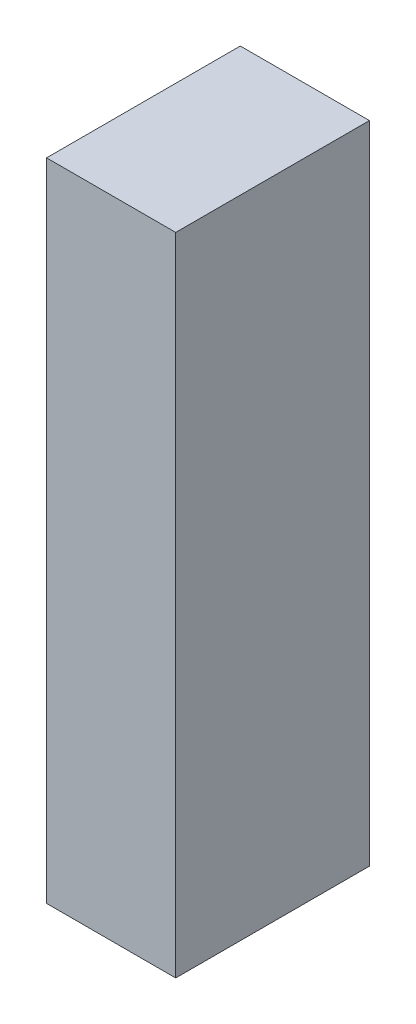
ISO-10303-21;
HEADER;
FILE_DESCRIPTION(('STEP AP214'),'2;1');
FILE_NAME('part.step','',(''),(''),'','','');
FILE_SCHEMA(('AUTOMOTIVE_DESIGN { 1 0 10303 214 1 1 1 1 }'));
ENDSEC;
DATA;
#1=APPLICATION_CONTEXT('core data for automotive mechanical design processes');
#2=APPLICATION_PROTOCOL_DEFINITION('international standard','automotive_design',2000,#1);
#3=PRODUCT_CONTEXT('',#1,'mechanical');
#4=PRODUCT('Part','Part','',(#3));
#5=PRODUCT_RELATED_PRODUCT_CATEGORY('part','',(#4));
#6=PRODUCT_DEFINITION_FORMATION('','',#4);
#7=PRODUCT_DEFINITION_CONTEXT('part definition',#1,'design');
#8=PRODUCT_DEFINITION('design','',#6,#7);
#9=PRODUCT_DEFINITION_SHAPE('','',#8);
#10=(LENGTH_UNIT() NAMED_UNIT(*) SI_UNIT(.MILLI.,.METRE.));
#11=(NAMED_UNIT(*) PLANE_ANGLE_UNIT() SI_UNIT($,.RADIAN.));
#12=(NAMED_UNIT(*) SI_UNIT($,.STERADIAN.) SOLID_ANGLE_UNIT());
#13=UNCERTAINTY_MEASURE_WITH_UNIT(LENGTH_MEASURE(1.E-05),#10,'distance_accuracy_value','');
#14=(GEOMETRIC_REPRESENTATION_CONTEXT(3) GLOBAL_UNCERTAINTY_ASSIGNED_CONTEXT((#13)) GLOBAL_UNIT_ASSIGNED_CONTEXT((#10,
#11,#12)) REPRESENTATION_CONTEXT('',''));
#15=CARTESIAN_POINT('',(0.,0.,0.));
#16=DIRECTION('',(0.,0.,1.));
#17=DIRECTION('',(1.,0.,0.));
#18=AXIS2_PLACEMENT_3D('',#15,#16,#17);
#19=CARTESIAN_POINT('',(-345.,745.,5.));
#20=DIRECTION('',(1.,0.,0.));
#21=DIRECTION('',(0.,1.,0.));
#22=AXIS2_PLACEMENT_3D('',#19,#20,#21);
#23=PLANE('',#22);
#24=DIRECTION('',(0.,-1.,0.));
#25=VECTOR('',#24,1.);
#26=CARTESIAN_POINT('',(-345.,745.,-145.));
#27=LINE('',#26,#25);
#28=CARTESIAN_POINT('',(-345.,745.,-145.));
#29=VERTEX_POINT('',#28);
#30=CARTESIAN_POINT('',(-345.,245.,-145.));
#31=VERTEX_POINT('',#30);
#32=EDGE_CURVE('E97',#29,#31,#27,.T.);
#33=ORIENTED_EDGE('',*,*,#32,.T.);
#34=DIRECTION('',(0.,0.,-1.));
#35=VECTOR('',#34,1.);
#36=CARTESIAN_POINT('',(-345.,245.,5.));
#37=LINE('',#36,#35);
#38=CARTESIAN_POINT('',(-345.,245.,5.));
#39=VERTEX_POINT('',#38);
#40=EDGE_CURVE('E11',#39,#31,#37,.T.);
#41=ORIENTED_EDGE('',*,*,#40,.F.);
#42=DIRECTION('',(0.,-1.,0.));
#43=VECTOR('',#42,1.);
#44=CARTESIAN_POINT('',(-345.,745.,5.));
#45=LINE('',#44,#43);
#46=CARTESIAN_POINT('',(-345.,745.,5.));
#47=VERTEX_POINT('',#46);
#48=EDGE_CURVE('E85',#47,#39,#45,.T.);
#49=ORIENTED_EDGE('',*,*,#48,.F.);
#50=DIRECTION('',(0.,0.,-1.));
#51=VECTOR('',#50,1.);
#52=CARTESIAN_POINT('',(-345.,745.,5.));
#53=LINE('',#52,#51);
#54=EDGE_CURVE('E93',#47,#29,#53,.T.);
#55=ORIENTED_EDGE('',*,*,#54,.T.);
#56=EDGE_LOOP('',(#33,#41,#49,#55));
#57=FACE_BOUND('',#56,.T.);
#58=ADVANCED_FACE('F34',(#57),#23,.F.);
#59=CARTESIAN_POINT('',(-345.,245.,5.));
#60=DIRECTION('',(0.,1.,0.));
#61=DIRECTION('',(0.,0.,1.));
#62=AXIS2_PLACEMENT_3D('',#59,#60,#61);
#63=PLANE('',#62);
#64=DIRECTION('',(1.,0.,0.));
#65=VECTOR('',#64,1.);
#66=CARTESIAN_POINT('',(-345.,245.,-145.));
#67=LINE('',#66,#65);
#68=CARTESIAN_POINT('',(-245.,245.,-145.));
#69=VERTEX_POINT('',#68);
#70=EDGE_CURVE('E89',#31,#69,#67,.T.);
#71=ORIENTED_EDGE('',*,*,#70,.T.);
#72=DIRECTION('',(0.,0.,-1.));
#73=VECTOR('',#72,1.);
#74=CARTESIAN_POINT('',(-245.,245.,5.));
#75=LINE('',#74,#73);
#76=CARTESIAN_POINT('',(-245.,245.,5.));
#77=VERTEX_POINT('',#76);
#78=EDGE_CURVE('E42',#77,#69,#75,.T.);
#79=ORIENTED_EDGE('',*,*,#78,.F.);
#80=DIRECTION('',(1.,0.,0.));
#81=VECTOR('',#80,1.);
#82=CARTESIAN_POINT('',(-345.,245.,5.));
#83=LINE('',#82,#81);
#84=EDGE_CURVE('E80',#39,#77,#83,.T.);
#85=ORIENTED_EDGE('',*,*,#84,.F.);
#86=ORIENTED_EDGE('',*,*,#40,.T.);
#87=EDGE_LOOP('',(#71,#79,#85,#86));
#88=FACE_BOUND('',#87,.T.);
#89=ADVANCED_FACE('F88',(#88),#63,.F.);
#90=CARTESIAN_POINT('',(-245.,745.,5.));
#91=DIRECTION('',(-1.,0.,0.));
#92=DIRECTION('',(0.,-1.,0.));
#93=AXIS2_PLACEMENT_3D('',#90,#91,#92);
#94=PLANE('',#93);
#95=DIRECTION('',(0.,1.,0.));
#96=VECTOR('',#95,1.);
#97=CARTESIAN_POINT('',(-245.,745.,-145.));
#98=LINE('',#97,#96);
#99=CARTESIAN_POINT('',(-245.,745.,-145.));
#100=VERTEX_POINT('',#99);
#101=EDGE_CURVE('E67',#69,#100,#98,.T.);
#102=ORIENTED_EDGE('',*,*,#101,.T.);
#103=DIRECTION('',(0.,0.,-1.));
#104=VECTOR('',#103,1.);
#105=CARTESIAN_POINT('',(-245.,745.,5.));
#106=LINE('',#105,#104);
#107=CARTESIAN_POINT('',(-245.,745.,5.));
#108=VERTEX_POINT('',#107);
#109=EDGE_CURVE('E90',#108,#100,#106,.T.);
#110=ORIENTED_EDGE('',*,*,#109,.F.);
#111=DIRECTION('',(0.,1.,0.));
#112=VECTOR('',#111,1.);
#113=CARTESIAN_POINT('',(-245.,745.,5.));
#114=LINE('',#113,#112);
#115=EDGE_CURVE('E83',#77,#108,#114,.T.);
#116=ORIENTED_EDGE('',*,*,#115,.F.);
#117=ORIENTED_EDGE('',*,*,#78,.T.);
#118=EDGE_LOOP('',(#102,#110,#116,#117));
#119=FACE_BOUND('',#118,.T.);
#120=ADVANCED_FACE('F91',(#119),#94,.F.);
#121=CARTESIAN_POINT('',(-345.,745.,5.));
#122=DIRECTION('',(0.,-1.,0.));
#123=DIRECTION('',(0.,0.,-1.));
#124=AXIS2_PLACEMENT_3D('',#121,#122,#123);
#125=PLANE('',#124);
#126=DIRECTION('',(-1.,0.,0.));
#127=VECTOR('',#126,1.);
#128=CARTESIAN_POINT('',(-345.,745.,-145.));
#129=LINE('',#128,#127);
#130=EDGE_CURVE('E73',#100,#29,#129,.T.);
#131=ORIENTED_EDGE('',*,*,#130,.T.);
#132=ORIENTED_EDGE('',*,*,#54,.F.);
#133=DIRECTION('',(-1.,0.,0.));
#134=VECTOR('',#133,1.);
#135=CARTESIAN_POINT('',(-345.,745.,5.));
#136=LINE('',#135,#134);
#137=EDGE_CURVE('E50',#108,#47,#136,.T.);
#138=ORIENTED_EDGE('',*,*,#137,.F.);
#139=ORIENTED_EDGE('',*,*,#109,.T.);
#140=EDGE_LOOP('',(#131,#132,#138,#139));
#141=FACE_BOUND('',#140,.T.);
#142=ADVANCED_FACE('F104',(#141),#125,.F.);
#143=CARTESIAN_POINT('',(0.,0.,5.));
#144=DIRECTION('',(0.,0.,1.));
#145=DIRECTION('',(1.,0.,0.));
#146=AXIS2_PLACEMENT_3D('',#143,#144,#145);
#147=PLANE('',#146);
#148=ORIENTED_EDGE('',*,*,#48,.T.);
#149=ORIENTED_EDGE('',*,*,#84,.T.);
#150=ORIENTED_EDGE('',*,*,#115,.T.);
#151=ORIENTED_EDGE('',*,*,#137,.T.);
#152=EDGE_LOOP('',(#148,#149,#150,#151));
#153=FACE_BOUND('',#152,.T.);
#154=ADVANCED_FACE('F81',(#153),#147,.T.);
#155=CARTESIAN_POINT('',(0.,0.,-145.));
#156=DIRECTION('',(0.,0.,1.));
#157=DIRECTION('',(1.,0.,0.));
#158=AXIS2_PLACEMENT_3D('',#155,#156,#157);
#159=PLANE('',#158);
#160=ORIENTED_EDGE('',*,*,#32,.F.);
#161=ORIENTED_EDGE('',*,*,#130,.F.);
#162=ORIENTED_EDGE('',*,*,#101,.F.);
#163=ORIENTED_EDGE('',*,*,#70,.F.);
#164=EDGE_LOOP('',(#160,#161,#162,#163));
#165=FACE_BOUND('',#164,.T.);
#166=ADVANCED_FACE('F107',(#165),#159,.F.);
#167=CLOSED_SHELL('',(#58,#89,#120,#142,#154,#166));
#168=MANIFOLD_SOLID_BREP('B2',#167);
#169=ADVANCED_BREP_SHAPE_REPRESENTATION('',(#18,#168),#14);
#170=SHAPE_DEFINITION_REPRESENTATION(#9,#169);
ENDSEC;
END-ISO-10303-21;
